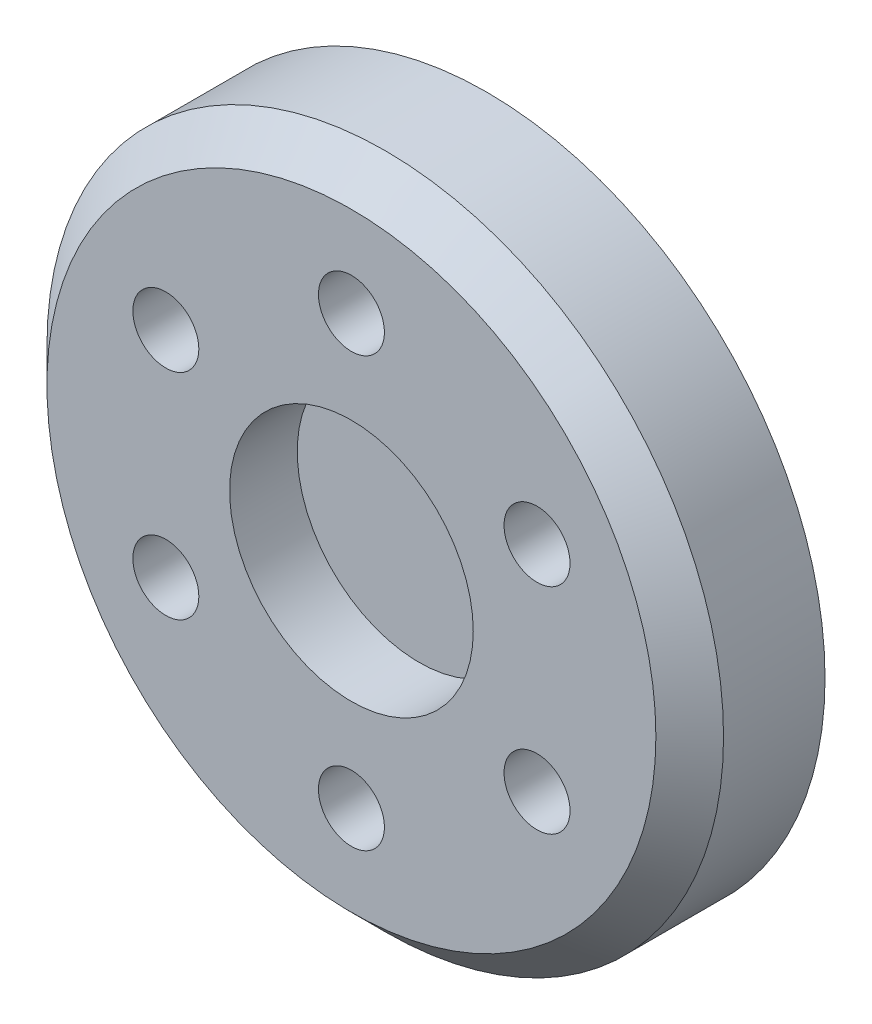
ISO-10303-21;
HEADER;
FILE_DESCRIPTION(('STEP AP214'),'2;1');
FILE_NAME('part.step','',(''),(''),'','','');
FILE_SCHEMA(('AUTOMOTIVE_DESIGN { 1 0 10303 214 1 1 1 1 }'));
ENDSEC;
DATA;
#1=APPLICATION_CONTEXT('core data for automotive mechanical design processes');
#2=APPLICATION_PROTOCOL_DEFINITION('international standard','automotive_design',2000,#1);
#3=PRODUCT_CONTEXT('',#1,'mechanical');
#4=PRODUCT('Part','Part','',(#3));
#5=PRODUCT_RELATED_PRODUCT_CATEGORY('part','',(#4));
#6=PRODUCT_DEFINITION_FORMATION('','',#4);
#7=PRODUCT_DEFINITION_CONTEXT('part definition',#1,'design');
#8=PRODUCT_DEFINITION('design','',#6,#7);
#9=PRODUCT_DEFINITION_SHAPE('','',#8);
#10=(LENGTH_UNIT() NAMED_UNIT(*) SI_UNIT(.MILLI.,.METRE.));
#11=(NAMED_UNIT(*) PLANE_ANGLE_UNIT() SI_UNIT($,.RADIAN.));
#12=(NAMED_UNIT(*) SI_UNIT($,.STERADIAN.) SOLID_ANGLE_UNIT());
#13=UNCERTAINTY_MEASURE_WITH_UNIT(LENGTH_MEASURE(1.E-05),#10,'distance_accuracy_value','');
#14=(GEOMETRIC_REPRESENTATION_CONTEXT(3) GLOBAL_UNCERTAINTY_ASSIGNED_CONTEXT((#13)) GLOBAL_UNIT_ASSIGNED_CONTEXT((#10,
#11,#12)) REPRESENTATION_CONTEXT('',''));
#15=CARTESIAN_POINT('',(0.,0.,0.));
#16=DIRECTION('',(0.,0.,1.));
#17=DIRECTION('',(1.,0.,0.));
#18=AXIS2_PLACEMENT_3D('',#15,#16,#17);
#19=CARTESIAN_POINT('',(0.,0.,20.));
#20=DIRECTION('',(0.,0.,-1.));
#21=DIRECTION('',(-1.,0.,0.));
#22=AXIS2_PLACEMENT_3D('',#19,#20,#21);
#23=CYLINDRICAL_SURFACE('',#22,15.);
#24=CARTESIAN_POINT('',(0.,0.,20.));
#25=DIRECTION('',(0.,0.,1.));
#26=DIRECTION('',(1.,0.,0.));
#27=AXIS2_PLACEMENT_3D('',#24,#25,#26);
#28=CIRCLE('',#27,15.);
#29=CARTESIAN_POINT('',(15.,0.,20.));
#30=VERTEX_POINT('',#29);
#31=EDGE_CURVE('E49',#30,#30,#28,.T.);
#32=ORIENTED_EDGE('',*,*,#31,.F.);
#33=EDGE_LOOP('',(#32));
#34=FACE_BOUND('',#33,.T.);
#35=CARTESIAN_POINT('',(0.,0.,5.));
#36=DIRECTION('',(0.,0.,-1.));
#37=DIRECTION('',(-1.,0.,0.));
#38=AXIS2_PLACEMENT_3D('',#35,#36,#37);
#39=CIRCLE('',#38,15.);
#40=CARTESIAN_POINT('',(-15.,0.,5.));
#41=VERTEX_POINT('',#40);
#42=EDGE_CURVE('E10',#41,#41,#39,.T.);
#43=ORIENTED_EDGE('',*,*,#42,.F.);
#44=EDGE_LOOP('',(#43));
#45=FACE_BOUND('',#44,.T.);
#46=ADVANCED_FACE('F33',(#34,#45),#23,.T.);
#47=CARTESIAN_POINT('',(0.,0.,40.));
#48=DIRECTION('',(0.,0.,-1.));
#49=DIRECTION('',(-1.,0.,0.));
#50=AXIS2_PLACEMENT_3D('',#47,#48,#49);
#51=CYLINDRICAL_SURFACE('',#50,50.);
#52=CARTESIAN_POINT('',(0.,0.,35.));
#53=DIRECTION('',(0.,0.,1.));
#54=DIRECTION('',(1.,0.,0.));
#55=AXIS2_PLACEMENT_3D('',#52,#53,#54);
#56=CIRCLE('',#55,50.);
#57=CARTESIAN_POINT('',(50.,0.,35.));
#58=VERTEX_POINT('',#57);
#59=EDGE_CURVE('E41',#58,#58,#56,.F.);
#60=ORIENTED_EDGE('',*,*,#59,.T.);
#61=EDGE_LOOP('',(#60));
#62=FACE_BOUND('',#61,.T.);
#63=CARTESIAN_POINT('',(0.,0.,20.));
#64=DIRECTION('',(0.,0.,1.));
#65=DIRECTION('',(1.,0.,0.));
#66=AXIS2_PLACEMENT_3D('',#63,#64,#65);
#67=CIRCLE('',#66,50.);
#68=CARTESIAN_POINT('',(50.,0.,20.));
#69=VERTEX_POINT('',#68);
#70=EDGE_CURVE('E54',#69,#69,#67,.T.);
#71=ORIENTED_EDGE('',*,*,#70,.T.);
#72=EDGE_LOOP('',(#71));
#73=FACE_BOUND('',#72,.T.);
#74=ADVANCED_FACE('F122',(#62,#73),#51,.T.);
#75=CARTESIAN_POINT('',(0.,0.,40.));
#76=DIRECTION('',(0.,0.,1.));
#77=DIRECTION('',(1.,0.,0.));
#78=AXIS2_PLACEMENT_3D('',#75,#76,#77);
#79=PLANE('',#78);
#80=CARTESIAN_POINT('',(-27.4296679614969,-15.8365261813554,40.));
#81=DIRECTION('',(0.,0.,1.));
#82=DIRECTION('',(1.,0.,0.));
#83=AXIS2_PLACEMENT_3D('',#80,#81,#82);
#84=CIRCLE('',#83,4.87659849094501);
#85=CARTESIAN_POINT('',(-22.5530694705519,-15.8365261813554,40.));
#86=VERTEX_POINT('',#85);
#87=EDGE_CURVE('E79',#86,#86,#84,.T.);
#88=ORIENTED_EDGE('',*,*,#87,.F.);
#89=EDGE_LOOP('',(#88));
#90=FACE_BOUND('',#89,.T.);
#91=CARTESIAN_POINT('',(3.58917267344883E-12,-31.6730523627077,40.));
#92=DIRECTION('',(0.,0.,1.));
#93=DIRECTION('',(1.,0.,0.));
#94=AXIS2_PLACEMENT_3D('',#91,#92,#93);
#95=CIRCLE('',#94,4.87659849094533);
#96=CARTESIAN_POINT('',(4.87659849094892,-31.6730523627077,40.));
#97=VERTEX_POINT('',#96);
#98=EDGE_CURVE('E68',#97,#97,#95,.T.);
#99=ORIENTED_EDGE('',*,*,#98,.F.);
#100=EDGE_LOOP('',(#99));
#101=FACE_BOUND('',#100,.T.);
#102=CARTESIAN_POINT('',(27.4296679615023,-15.8365261813523,40.));
#103=DIRECTION('',(0.,0.,1.));
#104=DIRECTION('',(1.,0.,0.));
#105=AXIS2_PLACEMENT_3D('',#102,#103,#104);
#106=CIRCLE('',#105,4.87659849094396);
#107=CARTESIAN_POINT('',(32.3062664524462,-15.8365261813523,40.));
#108=VERTEX_POINT('',#107);
#109=EDGE_CURVE('E67',#108,#108,#106,.T.);
#110=ORIENTED_EDGE('',*,*,#109,.F.);
#111=EDGE_LOOP('',(#110));
#112=FACE_BOUND('',#111,.T.);
#113=CARTESIAN_POINT('',(0.,0.,40.));
#114=DIRECTION('',(0.,0.,1.));
#115=DIRECTION('',(1.,0.,0.));
#116=AXIS2_PLACEMENT_3D('',#113,#114,#115);
#117=CIRCLE('',#116,18.0076628352492);
#118=CARTESIAN_POINT('',(18.0076628352492,0.,40.));
#119=VERTEX_POINT('',#118);
#120=EDGE_CURVE('E61',#119,#119,#117,.T.);
#121=ORIENTED_EDGE('',*,*,#120,.F.);
#122=EDGE_LOOP('',(#121));
#123=FACE_BOUND('',#122,.T.);
#124=CARTESIAN_POINT('',(-27.4296679614987,15.8365261813523,40.));
#125=DIRECTION('',(0.,0.,1.));
#126=DIRECTION('',(1.,0.,0.));
#127=AXIS2_PLACEMENT_3D('',#124,#125,#126);
#128=CIRCLE('',#127,4.87659849094338);
#129=CARTESIAN_POINT('',(-22.5530694705553,15.8365261813523,40.));
#130=VERTEX_POINT('',#129);
#131=EDGE_CURVE('E80',#130,#130,#128,.T.);
#132=ORIENTED_EDGE('',*,*,#131,.F.);
#133=EDGE_LOOP('',(#132));
#134=FACE_BOUND('',#133,.T.);
#135=CARTESIAN_POINT('',(0.,31.6730523627077,40.));
#136=DIRECTION('',(0.,0.,1.));
#137=DIRECTION('',(1.,0.,0.));
#138=AXIS2_PLACEMENT_3D('',#135,#136,#137);
#139=CIRCLE('',#138,4.87659849094169);
#140=CARTESIAN_POINT('',(4.87659849094169,31.6730523627077,40.));
#141=VERTEX_POINT('',#140);
#142=EDGE_CURVE('E91',#141,#141,#139,.T.);
#143=ORIENTED_EDGE('',*,*,#142,.F.);
#144=EDGE_LOOP('',(#143));
#145=FACE_BOUND('',#144,.T.);
#146=CARTESIAN_POINT('',(27.4296679615005,15.8365261813554,40.));
#147=DIRECTION('',(0.,0.,1.));
#148=DIRECTION('',(1.,0.,0.));
#149=AXIS2_PLACEMENT_3D('',#146,#147,#148);
#150=CIRCLE('',#149,4.87659849094217);
#151=CARTESIAN_POINT('',(32.3062664524426,15.8365261813554,40.));
#152=VERTEX_POINT('',#151);
#153=EDGE_CURVE('E58',#152,#152,#150,.T.);
#154=ORIENTED_EDGE('',*,*,#153,.F.);
#155=EDGE_LOOP('',(#154));
#156=FACE_BOUND('',#155,.T.);
#157=CARTESIAN_POINT('',(0.,0.,40.));
#158=DIRECTION('',(0.,0.,1.));
#159=DIRECTION('',(1.,0.,0.));
#160=AXIS2_PLACEMENT_3D('',#157,#158,#159);
#161=CIRCLE('',#160,45.);
#162=CARTESIAN_POINT('',(45.,0.,40.));
#163=VERTEX_POINT('',#162);
#164=EDGE_CURVE('E45',#163,#163,#161,.T.);
#165=ORIENTED_EDGE('',*,*,#164,.T.);
#166=EDGE_LOOP('',(#165));
#167=FACE_BOUND('',#166,.T.);
#168=ADVANCED_FACE('F129',(#90,#101,#112,#123,#134,#145,#156,#167),#79,.T.);
#169=CARTESIAN_POINT('',(0.,0.,20.));
#170=DIRECTION('',(0.,0.,1.));
#171=DIRECTION('',(1.,0.,0.));
#172=AXIS2_PLACEMENT_3D('',#169,#170,#171);
#173=PLANE('',#172);
#174=ORIENTED_EDGE('',*,*,#31,.T.);
#175=EDGE_LOOP('',(#174));
#176=FACE_BOUND('',#175,.T.);
#177=ORIENTED_EDGE('',*,*,#70,.F.);
#178=EDGE_LOOP('',(#177));
#179=FACE_BOUND('',#178,.T.);
#180=ADVANCED_FACE('F134',(#176,#179),#173,.F.);
#181=CARTESIAN_POINT('',(0.,0.,40.));
#182=DIRECTION('',(0.,0.,-1.));
#183=DIRECTION('',(-1.,0.,0.));
#184=AXIS2_PLACEMENT_3D('',#181,#182,#183);
#185=CONICAL_SURFACE('',#184,45.,0.785398163397446);
#186=ORIENTED_EDGE('',*,*,#59,.F.);
#187=EDGE_LOOP('',(#186));
#188=FACE_BOUND('',#187,.T.);
#189=ORIENTED_EDGE('',*,*,#164,.F.);
#190=EDGE_LOOP('',(#189));
#191=FACE_BOUND('',#190,.T.);
#192=ADVANCED_FACE('F36',(#188,#191),#185,.T.);
#193=CARTESIAN_POINT('',(27.4296679615005,15.8365261813554,30.));
#194=DIRECTION('',(0.,0.,1.));
#195=DIRECTION('',(1.,0.,0.));
#196=AXIS2_PLACEMENT_3D('',#193,#194,#195);
#197=CYLINDRICAL_SURFACE('',#196,4.87659849094217);
#198=CARTESIAN_POINT('',(27.4296679615005,15.8365261813554,30.));
#199=DIRECTION('',(0.,0.,1.));
#200=DIRECTION('',(1.,0.,0.));
#201=AXIS2_PLACEMENT_3D('',#198,#199,#200);
#202=CIRCLE('',#201,4.87659849094217);
#203=CARTESIAN_POINT('',(32.3062664524426,15.8365261813554,30.));
#204=VERTEX_POINT('',#203);
#205=EDGE_CURVE('E57',#204,#204,#202,.T.);
#206=ORIENTED_EDGE('',*,*,#205,.F.);
#207=EDGE_LOOP('',(#206));
#208=FACE_BOUND('',#207,.T.);
#209=ORIENTED_EDGE('',*,*,#153,.T.);
#210=EDGE_LOOP('',(#209));
#211=FACE_BOUND('',#210,.T.);
#212=ADVANCED_FACE('F141',(#208,#211),#197,.F.);
#213=CARTESIAN_POINT('',(0.,0.,30.));
#214=DIRECTION('',(0.,0.,1.));
#215=DIRECTION('',(1.,0.,0.));
#216=AXIS2_PLACEMENT_3D('',#213,#214,#215);
#217=PLANE('',#216);
#218=ORIENTED_EDGE('',*,*,#205,.T.);
#219=EDGE_LOOP('',(#218));
#220=FACE_BOUND('',#219,.T.);
#221=ADVANCED_FACE('F144',(#220),#217,.T.);
#222=CARTESIAN_POINT('',(0.,31.6730523627077,30.));
#223=DIRECTION('',(0.,0.,1.));
#224=DIRECTION('',(1.,0.,0.));
#225=AXIS2_PLACEMENT_3D('',#222,#223,#224);
#226=CYLINDRICAL_SURFACE('',#225,4.87659849094169);
#227=CARTESIAN_POINT('',(0.,31.6730523627077,30.));
#228=DIRECTION('',(0.,0.,1.));
#229=DIRECTION('',(1.,0.,0.));
#230=AXIS2_PLACEMENT_3D('',#227,#228,#229);
#231=CIRCLE('',#230,4.87659849094169);
#232=CARTESIAN_POINT('',(4.87659849094169,31.6730523627077,30.));
#233=VERTEX_POINT('',#232);
#234=EDGE_CURVE('E88',#233,#233,#231,.T.);
#235=ORIENTED_EDGE('',*,*,#234,.F.);
#236=EDGE_LOOP('',(#235));
#237=FACE_BOUND('',#236,.T.);
#238=ORIENTED_EDGE('',*,*,#142,.T.);
#239=EDGE_LOOP('',(#238));
#240=FACE_BOUND('',#239,.T.);
#241=ADVANCED_FACE('F148',(#237,#240),#226,.F.);
#242=CARTESIAN_POINT('',(0.,31.6730523627077,30.));
#243=DIRECTION('',(0.,0.,1.));
#244=DIRECTION('',(1.,0.,0.));
#245=AXIS2_PLACEMENT_3D('',#242,#243,#244);
#246=PLANE('',#245);
#247=ORIENTED_EDGE('',*,*,#234,.T.);
#248=EDGE_LOOP('',(#247));
#249=FACE_BOUND('',#248,.T.);
#250=ADVANCED_FACE('F182',(#249),#246,.T.);
#251=CARTESIAN_POINT('',(-27.4296679614987,15.8365261813523,30.));
#252=DIRECTION('',(0.,0.,1.));
#253=DIRECTION('',(1.,0.,0.));
#254=AXIS2_PLACEMENT_3D('',#251,#252,#253);
#255=CYLINDRICAL_SURFACE('',#254,4.87659849094338);
#256=CARTESIAN_POINT('',(-27.4296679614987,15.8365261813523,30.));
#257=DIRECTION('',(0.,0.,1.));
#258=DIRECTION('',(1.,0.,0.));
#259=AXIS2_PLACEMENT_3D('',#256,#257,#258);
#260=CIRCLE('',#259,4.87659849094338);
#261=CARTESIAN_POINT('',(-22.5530694705553,15.8365261813523,30.));
#262=VERTEX_POINT('',#261);
#263=EDGE_CURVE('E95',#262,#262,#260,.T.);
#264=ORIENTED_EDGE('',*,*,#263,.F.);
#265=EDGE_LOOP('',(#264));
#266=FACE_BOUND('',#265,.T.);
#267=ORIENTED_EDGE('',*,*,#131,.T.);
#268=EDGE_LOOP('',(#267));
#269=FACE_BOUND('',#268,.T.);
#270=ADVANCED_FACE('F185',(#266,#269),#255,.F.);
#271=CARTESIAN_POINT('',(0.,0.,30.));
#272=DIRECTION('',(0.,0.,1.));
#273=DIRECTION('',(1.,0.,0.));
#274=AXIS2_PLACEMENT_3D('',#271,#272,#273);
#275=PLANE('',#274);
#276=ORIENTED_EDGE('',*,*,#263,.T.);
#277=EDGE_LOOP('',(#276));
#278=FACE_BOUND('',#277,.T.);
#279=ADVANCED_FACE('F166',(#278),#275,.T.);
#280=CARTESIAN_POINT('',(0.,0.,30.));
#281=DIRECTION('',(0.,0.,1.));
#282=DIRECTION('',(1.,0.,0.));
#283=AXIS2_PLACEMENT_3D('',#280,#281,#282);
#284=CYLINDRICAL_SURFACE('',#283,18.0076628352492);
#285=CARTESIAN_POINT('',(0.,0.,30.));
#286=DIRECTION('',(0.,0.,1.));
#287=DIRECTION('',(1.,0.,0.));
#288=AXIS2_PLACEMENT_3D('',#285,#286,#287);
#289=CIRCLE('',#288,18.0076628352492);
#290=CARTESIAN_POINT('',(18.0076628352492,0.,30.));
#291=VERTEX_POINT('',#290);
#292=EDGE_CURVE('E71',#291,#291,#289,.T.);
#293=ORIENTED_EDGE('',*,*,#292,.F.);
#294=EDGE_LOOP('',(#293));
#295=FACE_BOUND('',#294,.T.);
#296=ORIENTED_EDGE('',*,*,#120,.T.);
#297=EDGE_LOOP('',(#296));
#298=FACE_BOUND('',#297,.T.);
#299=ADVANCED_FACE('F162',(#295,#298),#284,.F.);
#300=CARTESIAN_POINT('',(0.,0.,30.));
#301=DIRECTION('',(0.,0.,1.));
#302=DIRECTION('',(1.,0.,0.));
#303=AXIS2_PLACEMENT_3D('',#300,#301,#302);
#304=PLANE('',#303);
#305=ORIENTED_EDGE('',*,*,#292,.T.);
#306=EDGE_LOOP('',(#305));
#307=FACE_BOUND('',#306,.T.);
#308=ADVANCED_FACE('F158',(#307),#304,.T.);
#309=CARTESIAN_POINT('',(27.4296679615023,-15.8365261813523,30.));
#310=DIRECTION('',(0.,0.,1.));
#311=DIRECTION('',(1.,0.,0.));
#312=AXIS2_PLACEMENT_3D('',#309,#310,#311);
#313=CYLINDRICAL_SURFACE('',#312,4.87659849094396);
#314=CARTESIAN_POINT('',(27.4296679615023,-15.8365261813523,30.));
#315=DIRECTION('',(0.,0.,1.));
#316=DIRECTION('',(1.,0.,0.));
#317=AXIS2_PLACEMENT_3D('',#314,#315,#316);
#318=CIRCLE('',#317,4.87659849094396);
#319=CARTESIAN_POINT('',(32.3062664524462,-15.8365261813523,30.));
#320=VERTEX_POINT('',#319);
#321=EDGE_CURVE('E64',#320,#320,#318,.T.);
#322=ORIENTED_EDGE('',*,*,#321,.F.);
#323=EDGE_LOOP('',(#322));
#324=FACE_BOUND('',#323,.T.);
#325=ORIENTED_EDGE('',*,*,#109,.T.);
#326=EDGE_LOOP('',(#325));
#327=FACE_BOUND('',#326,.T.);
#328=ADVANCED_FACE('F154',(#324,#327),#313,.F.);
#329=CARTESIAN_POINT('',(0.,0.,30.));
#330=DIRECTION('',(0.,0.,1.));
#331=DIRECTION('',(1.,0.,0.));
#332=AXIS2_PLACEMENT_3D('',#329,#330,#331);
#333=PLANE('',#332);
#334=ORIENTED_EDGE('',*,*,#321,.T.);
#335=EDGE_LOOP('',(#334));
#336=FACE_BOUND('',#335,.T.);
#337=ADVANCED_FACE('F150',(#336),#333,.T.);
#338=CARTESIAN_POINT('',(3.58917267344883E-12,-31.6730523627077,30.));
#339=DIRECTION('',(0.,0.,1.));
#340=DIRECTION('',(1.,0.,0.));
#341=AXIS2_PLACEMENT_3D('',#338,#339,#340);
#342=CYLINDRICAL_SURFACE('',#341,4.87659849094533);
#343=CARTESIAN_POINT('',(3.58917267344883E-12,-31.6730523627077,30.));
#344=DIRECTION('',(0.,0.,1.));
#345=DIRECTION('',(1.,0.,0.));
#346=AXIS2_PLACEMENT_3D('',#343,#344,#345);
#347=CIRCLE('',#346,4.87659849094533);
#348=CARTESIAN_POINT('',(4.87659849094892,-31.6730523627077,30.));
#349=VERTEX_POINT('',#348);
#350=EDGE_CURVE('E83',#349,#349,#347,.T.);
#351=ORIENTED_EDGE('',*,*,#350,.F.);
#352=EDGE_LOOP('',(#351));
#353=FACE_BOUND('',#352,.T.);
#354=ORIENTED_EDGE('',*,*,#98,.T.);
#355=EDGE_LOOP('',(#354));
#356=FACE_BOUND('',#355,.T.);
#357=ADVANCED_FACE('F153',(#353,#356),#342,.F.);
#358=CARTESIAN_POINT('',(0.,0.,30.));
#359=DIRECTION('',(0.,0.,1.));
#360=DIRECTION('',(1.,0.,0.));
#361=AXIS2_PLACEMENT_3D('',#358,#359,#360);
#362=PLANE('',#361);
#363=ORIENTED_EDGE('',*,*,#350,.T.);
#364=EDGE_LOOP('',(#363));
#365=FACE_BOUND('',#364,.T.);
#366=ADVANCED_FACE('F174',(#365),#362,.T.);
#367=CARTESIAN_POINT('',(-27.4296679614969,-15.8365261813554,30.));
#368=DIRECTION('',(0.,0.,1.));
#369=DIRECTION('',(1.,0.,0.));
#370=AXIS2_PLACEMENT_3D('',#367,#368,#369);
#371=CYLINDRICAL_SURFACE('',#370,4.87659849094501);
#372=CARTESIAN_POINT('',(-27.4296679614969,-15.8365261813554,30.));
#373=DIRECTION('',(0.,0.,1.));
#374=DIRECTION('',(1.,0.,0.));
#375=AXIS2_PLACEMENT_3D('',#372,#373,#374);
#376=CIRCLE('',#375,4.87659849094501);
#377=CARTESIAN_POINT('',(-22.5530694705519,-15.8365261813554,30.));
#378=VERTEX_POINT('',#377);
#379=EDGE_CURVE('E76',#378,#378,#376,.T.);
#380=ORIENTED_EDGE('',*,*,#379,.F.);
#381=EDGE_LOOP('',(#380));
#382=FACE_BOUND('',#381,.T.);
#383=ORIENTED_EDGE('',*,*,#87,.T.);
#384=EDGE_LOOP('',(#383));
#385=FACE_BOUND('',#384,.T.);
#386=ADVANCED_FACE('F170',(#382,#385),#371,.F.);
#387=CARTESIAN_POINT('',(0.,0.,30.));
#388=DIRECTION('',(0.,0.,1.));
#389=DIRECTION('',(1.,0.,0.));
#390=AXIS2_PLACEMENT_3D('',#387,#388,#389);
#391=PLANE('',#390);
#392=ORIENTED_EDGE('',*,*,#379,.T.);
#393=EDGE_LOOP('',(#392));
#394=FACE_BOUND('',#393,.T.);
#395=ADVANCED_FACE('F119',(#394),#391,.T.);
#396=CARTESIAN_POINT('',(0.,0.,5.));
#397=DIRECTION('',(0.,0.,-1.));
#398=DIRECTION('',(-1.,0.,0.));
#399=AXIS2_PLACEMENT_3D('',#396,#397,#398);
#400=CYLINDRICAL_SURFACE('',#399,20.);
#401=CARTESIAN_POINT('',(0.,0.,5.));
#402=DIRECTION('',(0.,0.,-1.));
#403=DIRECTION('',(-1.,0.,0.));
#404=AXIS2_PLACEMENT_3D('',#401,#402,#403);
#405=CIRCLE('',#404,20.);
#406=CARTESIAN_POINT('',(-20.,0.,5.));
#407=VERTEX_POINT('',#406);
#408=EDGE_CURVE('E92',#407,#407,#405,.T.);
#409=ORIENTED_EDGE('',*,*,#408,.T.);
#410=EDGE_LOOP('',(#409));
#411=FACE_BOUND('',#410,.T.);
#412=CARTESIAN_POINT('',(0.,0.,0.));
#413=DIRECTION('',(0.,0.,-1.));
#414=DIRECTION('',(-1.,0.,0.));
#415=AXIS2_PLACEMENT_3D('',#412,#413,#414);
#416=CIRCLE('',#415,20.);
#417=CARTESIAN_POINT('',(-20.,0.,0.));
#418=VERTEX_POINT('',#417);
#419=EDGE_CURVE('E100',#418,#418,#416,.T.);
#420=ORIENTED_EDGE('',*,*,#419,.F.);
#421=EDGE_LOOP('',(#420));
#422=FACE_BOUND('',#421,.T.);
#423=ADVANCED_FACE('F106',(#411,#422),#400,.T.);
#424=CARTESIAN_POINT('',(0.,0.,5.));
#425=DIRECTION('',(0.,0.,-1.));
#426=DIRECTION('',(-1.,0.,0.));
#427=AXIS2_PLACEMENT_3D('',#424,#425,#426);
#428=PLANE('',#427);
#429=ORIENTED_EDGE('',*,*,#42,.T.);
#430=EDGE_LOOP('',(#429));
#431=FACE_BOUND('',#430,.T.);
#432=ORIENTED_EDGE('',*,*,#408,.F.);
#433=EDGE_LOOP('',(#432));
#434=FACE_BOUND('',#433,.T.);
#435=ADVANCED_FACE('F109',(#431,#434),#428,.F.);
#436=CARTESIAN_POINT('',(0.,0.,0.));
#437=DIRECTION('',(0.,0.,1.));
#438=DIRECTION('',(1.,0.,0.));
#439=AXIS2_PLACEMENT_3D('',#436,#437,#438);
#440=PLANE('',#439);
#441=ORIENTED_EDGE('',*,*,#419,.T.);
#442=EDGE_LOOP('',(#441));
#443=FACE_BOUND('',#442,.T.);
#444=ADVANCED_FACE('F111',(#443),#440,.F.);
#445=CLOSED_SHELL('',(#46,#74,#168,#180,#192,#212,#221,#241,#250,#270,#279,#299,#308,#328,#337,
#357,#366,#386,#395,#423,#435,#444));
#446=MANIFOLD_SOLID_BREP('B2',#445);
#447=ADVANCED_BREP_SHAPE_REPRESENTATION('',(#18,#446),#14);
#448=SHAPE_DEFINITION_REPRESENTATION(#9,#447);
ENDSEC;
END-ISO-10303-21;
